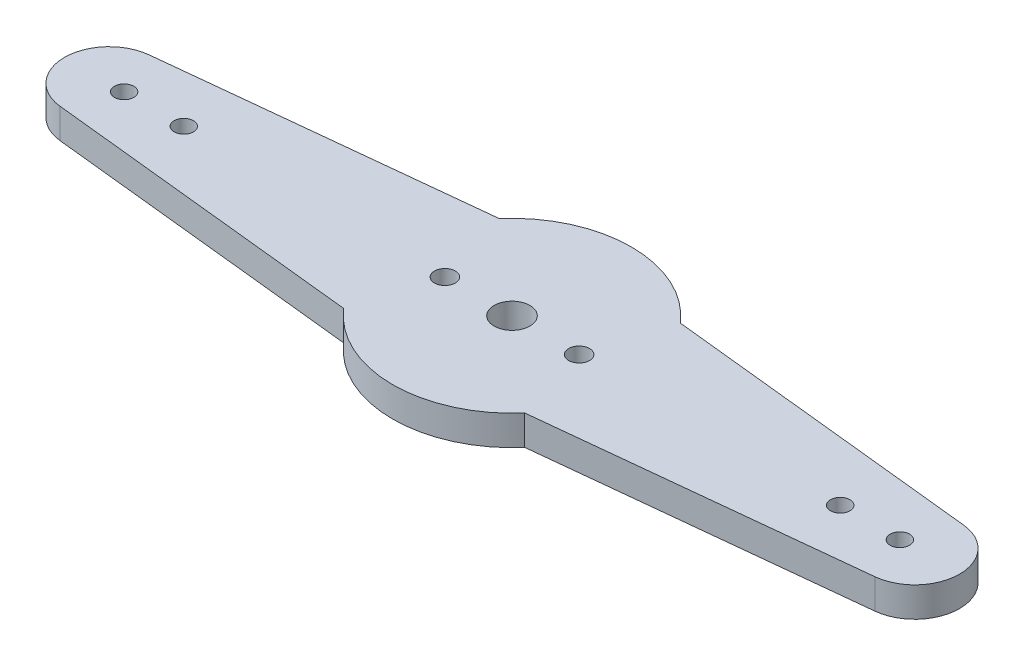
ISO-10303-21;
HEADER;
FILE_DESCRIPTION(('STEP AP214'),'2;1');
FILE_NAME('part.step','',(''),(''),'','','');
FILE_SCHEMA(('AUTOMOTIVE_DESIGN { 1 0 10303 214 1 1 1 1 }'));
ENDSEC;
DATA;
#1=APPLICATION_CONTEXT('core data for automotive mechanical design processes');
#2=APPLICATION_PROTOCOL_DEFINITION('international standard','automotive_design',2000,#1);
#3=PRODUCT_CONTEXT('',#1,'mechanical');
#4=PRODUCT('Part','Part','',(#3));
#5=PRODUCT_RELATED_PRODUCT_CATEGORY('part','',(#4));
#6=PRODUCT_DEFINITION_FORMATION('','',#4);
#7=PRODUCT_DEFINITION_CONTEXT('part definition',#1,'design');
#8=PRODUCT_DEFINITION('design','',#6,#7);
#9=PRODUCT_DEFINITION_SHAPE('','',#8);
#10=(LENGTH_UNIT() NAMED_UNIT(*) SI_UNIT(.MILLI.,.METRE.));
#11=(NAMED_UNIT(*) PLANE_ANGLE_UNIT() SI_UNIT($,.RADIAN.));
#12=(NAMED_UNIT(*) SI_UNIT($,.STERADIAN.) SOLID_ANGLE_UNIT());
#13=UNCERTAINTY_MEASURE_WITH_UNIT(LENGTH_MEASURE(1.E-05),#10,'distance_accuracy_value','');
#14=(GEOMETRIC_REPRESENTATION_CONTEXT(3) GLOBAL_UNCERTAINTY_ASSIGNED_CONTEXT((#13)) GLOBAL_UNIT_ASSIGNED_CONTEXT((#10,
#11,#12)) REPRESENTATION_CONTEXT('',''));
#15=CARTESIAN_POINT('',(0.,0.,0.));
#16=DIRECTION('',(0.,0.,1.));
#17=DIRECTION('',(1.,0.,0.));
#18=AXIS2_PLACEMENT_3D('',#15,#16,#17);
#19=CARTESIAN_POINT('',(0.,10.,0.));
#20=DIRECTION('',(0.,-1.,0.));
#21=DIRECTION('',(0.,0.,-1.));
#22=AXIS2_PLACEMENT_3D('',#19,#20,#21);
#23=CYLINDRICAL_SURFACE('',#22,40.);
#24=CARTESIAN_POINT('',(0.,0.,0.));
#25=DIRECTION('',(0.,1.,0.));
#26=DIRECTION('',(0.,0.,1.));
#27=AXIS2_PLACEMENT_3D('',#24,#25,#26);
#28=CIRCLE('',#27,40.);
#29=CARTESIAN_POINT('',(30.3249624577529,0.,-26.0844139657359));
#30=VERTEX_POINT('',#29);
#31=CARTESIAN_POINT('',(-30.3249624577529,0.,-26.0844139657359));
#32=VERTEX_POINT('',#31);
#33=EDGE_CURVE('E112',#30,#32,#28,.T.);
#34=ORIENTED_EDGE('',*,*,#33,.T.);
#35=DIRECTION('',(0.,-1.,0.));
#36=VECTOR('',#35,1.);
#37=CARTESIAN_POINT('',(-30.3249624577529,10.,-26.0844139657359));
#38=LINE('',#37,#36);
#39=CARTESIAN_POINT('',(-30.3249624577529,10.,-26.0844139657359));
#40=VERTEX_POINT('',#39);
#41=EDGE_CURVE('E11',#40,#32,#38,.T.);
#42=ORIENTED_EDGE('',*,*,#41,.F.);
#43=CARTESIAN_POINT('',(0.,10.,0.));
#44=DIRECTION('',(0.,1.,0.));
#45=DIRECTION('',(0.,0.,1.));
#46=AXIS2_PLACEMENT_3D('',#43,#44,#45);
#47=CIRCLE('',#46,40.);
#48=CARTESIAN_POINT('',(30.3249624577529,10.,-26.0844139657359));
#49=VERTEX_POINT('',#48);
#50=EDGE_CURVE('E113',#49,#40,#47,.T.);
#51=ORIENTED_EDGE('',*,*,#50,.F.);
#52=DIRECTION('',(0.,-1.,0.));
#53=VECTOR('',#52,1.);
#54=CARTESIAN_POINT('',(30.3249624577529,10.,-26.0844139657359));
#55=LINE('',#54,#53);
#56=EDGE_CURVE('E102',#49,#30,#55,.T.);
#57=ORIENTED_EDGE('',*,*,#56,.T.);
#58=EDGE_LOOP('',(#34,#42,#51,#57));
#59=FACE_BOUND('',#58,.T.);
#60=ADVANCED_FACE('F37',(#59),#23,.T.);
#61=CARTESIAN_POINT('',(-30.3249624577529,10.,-26.0844139657359));
#62=DIRECTION('',(0.104528463267647,0.,0.994521895368274));
#63=DIRECTION('',(0.994521895368274,0.,-0.104528463267647));
#64=AXIS2_PLACEMENT_3D('',#61,#62,#63);
#65=PLANE('',#64);
#66=DIRECTION('',(-0.994521895368274,0.,0.104528463267647));
#67=VECTOR('',#66,1.);
#68=CARTESIAN_POINT('',(-30.3249624577529,0.,-26.0844139657359));
#69=LINE('',#68,#67);
#70=CARTESIAN_POINT('',(-136.567926949015,0.,-14.9178284305241));
#71=VERTEX_POINT('',#70);
#72=EDGE_CURVE('E64',#32,#71,#69,.T.);
#73=ORIENTED_EDGE('',*,*,#72,.T.);
#74=DIRECTION('',(0.,-1.,0.));
#75=VECTOR('',#74,1.);
#76=CARTESIAN_POINT('',(-136.567926949015,10.,-14.9178284305241));
#77=LINE('',#76,#75);
#78=CARTESIAN_POINT('',(-136.567926949015,10.,-14.9178284305241));
#79=VERTEX_POINT('',#78);
#80=EDGE_CURVE('E45',#79,#71,#77,.T.);
#81=ORIENTED_EDGE('',*,*,#80,.F.);
#82=DIRECTION('',(-0.994521895368274,0.,0.104528463267647));
#83=VECTOR('',#82,1.);
#84=CARTESIAN_POINT('',(-30.3249624577529,10.,-26.0844139657359));
#85=LINE('',#84,#83);
#86=EDGE_CURVE('E53',#40,#79,#85,.T.);
#87=ORIENTED_EDGE('',*,*,#86,.F.);
#88=ORIENTED_EDGE('',*,*,#41,.T.);
#89=EDGE_LOOP('',(#73,#81,#87,#88));
#90=FACE_BOUND('',#89,.T.);
#91=ADVANCED_FACE('F127',(#90),#65,.F.);
#92=CARTESIAN_POINT('',(-135.,10.,0.));
#93=DIRECTION('',(0.,-1.,0.));
#94=DIRECTION('',(0.,0.,-1.));
#95=AXIS2_PLACEMENT_3D('',#92,#93,#94);
#96=CYLINDRICAL_SURFACE('',#95,15.);
#97=CARTESIAN_POINT('',(-135.,0.,0.));
#98=DIRECTION('',(0.,1.,0.));
#99=DIRECTION('',(0.,0.,1.));
#100=AXIS2_PLACEMENT_3D('',#97,#98,#99);
#101=CIRCLE('',#100,15.);
#102=CARTESIAN_POINT('',(-136.567926949015,0.,14.9178284305241));
#103=VERTEX_POINT('',#102);
#104=EDGE_CURVE('E115',#71,#103,#101,.T.);
#105=ORIENTED_EDGE('',*,*,#104,.T.);
#106=DIRECTION('',(0.,-1.,0.));
#107=VECTOR('',#106,1.);
#108=CARTESIAN_POINT('',(-136.567926949015,10.,14.9178284305241));
#109=LINE('',#108,#107);
#110=CARTESIAN_POINT('',(-136.567926949015,10.,14.9178284305241));
#111=VERTEX_POINT('',#110);
#112=EDGE_CURVE('E92',#111,#103,#109,.T.);
#113=ORIENTED_EDGE('',*,*,#112,.F.);
#114=CARTESIAN_POINT('',(-135.,10.,0.));
#115=DIRECTION('',(0.,1.,0.));
#116=DIRECTION('',(0.,0.,1.));
#117=AXIS2_PLACEMENT_3D('',#114,#115,#116);
#118=CIRCLE('',#117,15.);
#119=EDGE_CURVE('E117',#79,#111,#118,.T.);
#120=ORIENTED_EDGE('',*,*,#119,.F.);
#121=ORIENTED_EDGE('',*,*,#80,.T.);
#122=EDGE_LOOP('',(#105,#113,#120,#121));
#123=FACE_BOUND('',#122,.T.);
#124=ADVANCED_FACE('F125',(#123),#96,.T.);
#125=CARTESIAN_POINT('',(0.,10.,0.));
#126=DIRECTION('',(0.,1.,0.));
#127=DIRECTION('',(0.,0.,1.));
#128=AXIS2_PLACEMENT_3D('',#125,#126,#127);
#129=PLANE('',#128);
#130=CARTESIAN_POINT('',(130.,10.,0.));
#131=DIRECTION('',(0.,1.,0.));
#132=DIRECTION('',(0.,0.,1.));
#133=AXIS2_PLACEMENT_3D('',#130,#131,#132);
#134=CIRCLE('',#133,3.25000000000004);
#135=CARTESIAN_POINT('',(130.,10.,3.25000000000004));
#136=VERTEX_POINT('',#135);
#137=EDGE_CURVE('E390',#136,#136,#134,.T.);
#138=ORIENTED_EDGE('',*,*,#137,.F.);
#139=EDGE_LOOP('',(#138));
#140=FACE_BOUND('',#139,.T.);
#141=CARTESIAN_POINT('',(110.,10.,0.));
#142=DIRECTION('',(0.,1.,0.));
#143=DIRECTION('',(0.,0.,1.));
#144=AXIS2_PLACEMENT_3D('',#141,#142,#143);
#145=CIRCLE('',#144,3.25000000000001);
#146=CARTESIAN_POINT('',(110.,10.,3.25000000000001));
#147=VERTEX_POINT('',#146);
#148=EDGE_CURVE('E394',#147,#147,#145,.T.);
#149=ORIENTED_EDGE('',*,*,#148,.F.);
#150=EDGE_LOOP('',(#149));
#151=FACE_BOUND('',#150,.T.);
#152=CARTESIAN_POINT('',(-130.,10.,0.));
#153=DIRECTION('',(0.,1.,0.));
#154=DIRECTION('',(0.,0.,1.));
#155=AXIS2_PLACEMENT_3D('',#152,#153,#154);
#156=CIRCLE('',#155,3.25000000000001);
#157=CARTESIAN_POINT('',(-130.,10.,3.25000000000001));
#158=VERTEX_POINT('',#157);
#159=EDGE_CURVE('E425',#158,#158,#156,.T.);
#160=ORIENTED_EDGE('',*,*,#159,.F.);
#161=EDGE_LOOP('',(#160));
#162=FACE_BOUND('',#161,.T.);
#163=CARTESIAN_POINT('',(-110.,10.,0.));
#164=DIRECTION('',(0.,1.,0.));
#165=DIRECTION('',(0.,0.,1.));
#166=AXIS2_PLACEMENT_3D('',#163,#164,#165);
#167=CIRCLE('',#166,3.25000000000001);
#168=CARTESIAN_POINT('',(-110.,10.,3.25000000000001));
#169=VERTEX_POINT('',#168);
#170=EDGE_CURVE('E419',#169,#169,#167,.T.);
#171=ORIENTED_EDGE('',*,*,#170,.F.);
#172=EDGE_LOOP('',(#171));
#173=FACE_BOUND('',#172,.T.);
#174=CARTESIAN_POINT('',(0.,10.,0.));
#175=DIRECTION('',(0.,1.,0.));
#176=DIRECTION('',(0.,0.,1.));
#177=AXIS2_PLACEMENT_3D('',#174,#175,#176);
#178=CIRCLE('',#177,6.);
#179=CARTESIAN_POINT('',(0.,10.,6.));
#180=VERTEX_POINT('',#179);
#181=EDGE_CURVE('E411',#180,#180,#178,.T.);
#182=ORIENTED_EDGE('',*,*,#181,.F.);
#183=EDGE_LOOP('',(#182));
#184=FACE_BOUND('',#183,.T.);
#185=CARTESIAN_POINT('',(22.5,10.,0.));
#186=DIRECTION('',(0.,1.,0.));
#187=DIRECTION('',(0.,0.,1.));
#188=AXIS2_PLACEMENT_3D('',#185,#186,#187);
#189=CIRCLE('',#188,3.5);
#190=CARTESIAN_POINT('',(22.5,10.,3.49999999999999));
#191=VERTEX_POINT('',#190);
#192=EDGE_CURVE('E402',#191,#191,#189,.T.);
#193=ORIENTED_EDGE('',*,*,#192,.F.);
#194=EDGE_LOOP('',(#193));
#195=FACE_BOUND('',#194,.T.);
#196=CARTESIAN_POINT('',(-22.5,10.,0.));
#197=DIRECTION('',(0.,1.,0.));
#198=DIRECTION('',(0.,0.,1.));
#199=AXIS2_PLACEMENT_3D('',#196,#197,#198);
#200=CIRCLE('',#199,3.5);
#201=CARTESIAN_POINT('',(-22.5,10.,3.5));
#202=VERTEX_POINT('',#201);
#203=EDGE_CURVE('E176',#202,#202,#200,.T.);
#204=ORIENTED_EDGE('',*,*,#203,.F.);
#205=EDGE_LOOP('',(#204));
#206=FACE_BOUND('',#205,.T.);
#207=ORIENTED_EDGE('',*,*,#50,.T.);
#208=ORIENTED_EDGE('',*,*,#86,.T.);
#209=ORIENTED_EDGE('',*,*,#119,.T.);
#210=DIRECTION('',(-0.994521895368274,0.,-0.104528463267647));
#211=VECTOR('',#210,1.);
#212=CARTESIAN_POINT('',(-30.3249624577529,10.,26.0844139657359));
#213=LINE('',#212,#211);
#214=CARTESIAN_POINT('',(-30.3249624577529,10.,26.0844139657359));
#215=VERTEX_POINT('',#214);
#216=EDGE_CURVE('E93',#215,#111,#213,.T.);
#217=ORIENTED_EDGE('',*,*,#216,.F.);
#218=CARTESIAN_POINT('',(0.,10.,0.));
#219=DIRECTION('',(0.,-1.,0.));
#220=DIRECTION('',(0.,0.,-1.));
#221=AXIS2_PLACEMENT_3D('',#218,#219,#220);
#222=CIRCLE('',#221,40.);
#223=CARTESIAN_POINT('',(30.3249624577529,10.,26.0844139657359));
#224=VERTEX_POINT('',#223);
#225=EDGE_CURVE('E90',#224,#215,#222,.T.);
#226=ORIENTED_EDGE('',*,*,#225,.F.);
#227=DIRECTION('',(0.994521895368274,0.,-0.104528463267647));
#228=VECTOR('',#227,1.);
#229=CARTESIAN_POINT('',(30.3249624577529,10.,26.0844139657359));
#230=LINE('',#229,#228);
#231=CARTESIAN_POINT('',(136.567926949015,10.,14.9178284305241));
#232=VERTEX_POINT('',#231);
#233=EDGE_CURVE('E165',#224,#232,#230,.T.);
#234=ORIENTED_EDGE('',*,*,#233,.T.);
#235=CARTESIAN_POINT('',(135.,10.,0.));
#236=DIRECTION('',(0.,-1.,0.));
#237=DIRECTION('',(0.,0.,1.));
#238=AXIS2_PLACEMENT_3D('',#235,#236,#237);
#239=CIRCLE('',#238,15.);
#240=CARTESIAN_POINT('',(136.567926949015,10.,-14.9178284305241));
#241=VERTEX_POINT('',#240);
#242=EDGE_CURVE('E156',#241,#232,#239,.T.);
#243=ORIENTED_EDGE('',*,*,#242,.F.);
#244=DIRECTION('',(0.994521895368274,0.,0.104528463267647));
#245=VECTOR('',#244,1.);
#246=CARTESIAN_POINT('',(30.3249624577529,10.,-26.0844139657359));
#247=LINE('',#246,#245);
#248=EDGE_CURVE('E150',#49,#241,#247,.T.);
#249=ORIENTED_EDGE('',*,*,#248,.F.);
#250=EDGE_LOOP('',(#207,#208,#209,#217,#226,#234,#243,#249));
#251=FACE_BOUND('',#250,.T.);
#252=ADVANCED_FACE('F160',(#140,#151,#162,#173,#184,#195,#206,#251),#129,.T.);
#253=CARTESIAN_POINT('',(0.,0.,0.));
#254=DIRECTION('',(0.,1.,0.));
#255=DIRECTION('',(0.,0.,1.));
#256=AXIS2_PLACEMENT_3D('',#253,#254,#255);
#257=PLANE('',#256);
#258=CARTESIAN_POINT('',(130.,0.,0.));
#259=DIRECTION('',(0.,1.,0.));
#260=DIRECTION('',(0.,0.,1.));
#261=AXIS2_PLACEMENT_3D('',#258,#259,#260);
#262=CIRCLE('',#261,3.25000000000004);
#263=CARTESIAN_POINT('',(130.,0.,3.25000000000004));
#264=VERTEX_POINT('',#263);
#265=EDGE_CURVE('E387',#264,#264,#262,.T.);
#266=ORIENTED_EDGE('',*,*,#265,.T.);
#267=EDGE_LOOP('',(#266));
#268=FACE_BOUND('',#267,.T.);
#269=CARTESIAN_POINT('',(110.,0.,0.));
#270=DIRECTION('',(0.,1.,0.));
#271=DIRECTION('',(0.,0.,1.));
#272=AXIS2_PLACEMENT_3D('',#269,#270,#271);
#273=CIRCLE('',#272,3.25000000000001);
#274=CARTESIAN_POINT('',(110.,0.,3.25000000000001));
#275=VERTEX_POINT('',#274);
#276=EDGE_CURVE('E391',#275,#275,#273,.T.);
#277=ORIENTED_EDGE('',*,*,#276,.T.);
#278=EDGE_LOOP('',(#277));
#279=FACE_BOUND('',#278,.T.);
#280=CARTESIAN_POINT('',(-130.,0.,0.));
#281=DIRECTION('',(0.,1.,0.));
#282=DIRECTION('',(0.,0.,1.));
#283=AXIS2_PLACEMENT_3D('',#280,#281,#282);
#284=CIRCLE('',#283,3.25000000000001);
#285=CARTESIAN_POINT('',(-130.,0.,3.25000000000001));
#286=VERTEX_POINT('',#285);
#287=EDGE_CURVE('E428',#286,#286,#284,.T.);
#288=ORIENTED_EDGE('',*,*,#287,.T.);
#289=EDGE_LOOP('',(#288));
#290=FACE_BOUND('',#289,.T.);
#291=CARTESIAN_POINT('',(-110.,0.,0.));
#292=DIRECTION('',(0.,1.,0.));
#293=DIRECTION('',(0.,0.,1.));
#294=AXIS2_PLACEMENT_3D('',#291,#292,#293);
#295=CIRCLE('',#294,3.25000000000001);
#296=CARTESIAN_POINT('',(-110.,0.,3.25000000000001));
#297=VERTEX_POINT('',#296);
#298=EDGE_CURVE('E422',#297,#297,#295,.T.);
#299=ORIENTED_EDGE('',*,*,#298,.T.);
#300=EDGE_LOOP('',(#299));
#301=FACE_BOUND('',#300,.T.);
#302=CARTESIAN_POINT('',(0.,0.,0.));
#303=DIRECTION('',(0.,1.,0.));
#304=DIRECTION('',(0.,0.,1.));
#305=AXIS2_PLACEMENT_3D('',#302,#303,#304);
#306=CIRCLE('',#305,6.);
#307=CARTESIAN_POINT('',(0.,0.,6.));
#308=VERTEX_POINT('',#307);
#309=EDGE_CURVE('E416',#308,#308,#306,.T.);
#310=ORIENTED_EDGE('',*,*,#309,.T.);
#311=EDGE_LOOP('',(#310));
#312=FACE_BOUND('',#311,.T.);
#313=CARTESIAN_POINT('',(22.5,0.,0.));
#314=DIRECTION('',(0.,1.,0.));
#315=DIRECTION('',(0.,0.,1.));
#316=AXIS2_PLACEMENT_3D('',#313,#314,#315);
#317=CIRCLE('',#316,3.5);
#318=CARTESIAN_POINT('',(22.5,0.,3.49999999999999));
#319=VERTEX_POINT('',#318);
#320=EDGE_CURVE('E406',#319,#319,#317,.T.);
#321=ORIENTED_EDGE('',*,*,#320,.T.);
#322=EDGE_LOOP('',(#321));
#323=FACE_BOUND('',#322,.T.);
#324=CARTESIAN_POINT('',(-22.5,0.,0.));
#325=DIRECTION('',(0.,1.,0.));
#326=DIRECTION('',(0.,0.,1.));
#327=AXIS2_PLACEMENT_3D('',#324,#325,#326);
#328=CIRCLE('',#327,3.5);
#329=CARTESIAN_POINT('',(-22.5,0.,3.5));
#330=VERTEX_POINT('',#329);
#331=EDGE_CURVE('E173',#330,#330,#328,.T.);
#332=ORIENTED_EDGE('',*,*,#331,.T.);
#333=EDGE_LOOP('',(#332));
#334=FACE_BOUND('',#333,.T.);
#335=ORIENTED_EDGE('',*,*,#33,.F.);
#336=DIRECTION('',(0.994521895368274,0.,0.104528463267647));
#337=VECTOR('',#336,1.);
#338=CARTESIAN_POINT('',(30.3249624577529,0.,-26.0844139657359));
#339=LINE('',#338,#337);
#340=CARTESIAN_POINT('',(136.567926949015,0.,-14.9178284305241));
#341=VERTEX_POINT('',#340);
#342=EDGE_CURVE('E137',#30,#341,#339,.T.);
#343=ORIENTED_EDGE('',*,*,#342,.T.);
#344=CARTESIAN_POINT('',(135.,0.,0.));
#345=DIRECTION('',(0.,-1.,0.));
#346=DIRECTION('',(0.,0.,1.));
#347=AXIS2_PLACEMENT_3D('',#344,#345,#346);
#348=CIRCLE('',#347,15.);
#349=CARTESIAN_POINT('',(136.567926949015,0.,14.9178284305241));
#350=VERTEX_POINT('',#349);
#351=EDGE_CURVE('E147',#341,#350,#348,.T.);
#352=ORIENTED_EDGE('',*,*,#351,.T.);
#353=DIRECTION('',(0.994521895368274,0.,-0.104528463267647));
#354=VECTOR('',#353,1.);
#355=CARTESIAN_POINT('',(30.3249624577529,0.,26.0844139657359));
#356=LINE('',#355,#354);
#357=CARTESIAN_POINT('',(30.3249624577529,0.,26.0844139657359));
#358=VERTEX_POINT('',#357);
#359=EDGE_CURVE('E101',#358,#350,#356,.T.);
#360=ORIENTED_EDGE('',*,*,#359,.F.);
#361=CARTESIAN_POINT('',(0.,0.,0.));
#362=DIRECTION('',(0.,-1.,0.));
#363=DIRECTION('',(0.,0.,-1.));
#364=AXIS2_PLACEMENT_3D('',#361,#362,#363);
#365=CIRCLE('',#364,40.);
#366=CARTESIAN_POINT('',(-30.3249624577529,0.,26.0844139657359));
#367=VERTEX_POINT('',#366);
#368=EDGE_CURVE('E87',#358,#367,#365,.T.);
#369=ORIENTED_EDGE('',*,*,#368,.T.);
#370=DIRECTION('',(-0.994521895368274,0.,-0.104528463267647));
#371=VECTOR('',#370,1.);
#372=CARTESIAN_POINT('',(-30.3249624577529,0.,26.0844139657359));
#373=LINE('',#372,#371);
#374=EDGE_CURVE('E98',#367,#103,#373,.T.);
#375=ORIENTED_EDGE('',*,*,#374,.T.);
#376=ORIENTED_EDGE('',*,*,#104,.F.);
#377=ORIENTED_EDGE('',*,*,#72,.F.);
#378=EDGE_LOOP('',(#335,#343,#352,#360,#369,#375,#376,#377));
#379=FACE_BOUND('',#378,.T.);
#380=ADVANCED_FACE('F97',(#268,#279,#290,#301,#312,#323,#334,#379),#257,.F.);
#381=CARTESIAN_POINT('',(0.,10.,0.));
#382=DIRECTION('',(0.,-1.,0.));
#383=DIRECTION('',(0.,0.,-1.));
#384=AXIS2_PLACEMENT_3D('',#381,#382,#383);
#385=CYLINDRICAL_SURFACE('',#384,40.);
#386=ORIENTED_EDGE('',*,*,#368,.F.);
#387=DIRECTION('',(0.,-1.,0.));
#388=VECTOR('',#387,1.);
#389=CARTESIAN_POINT('',(30.3249624577529,10.,26.0844139657359));
#390=LINE('',#389,#388);
#391=EDGE_CURVE('E153',#224,#358,#390,.T.);
#392=ORIENTED_EDGE('',*,*,#391,.F.);
#393=ORIENTED_EDGE('',*,*,#225,.T.);
#394=DIRECTION('',(0.,-1.,0.));
#395=VECTOR('',#394,1.);
#396=CARTESIAN_POINT('',(-30.3249624577529,10.,26.0844139657359));
#397=LINE('',#396,#395);
#398=EDGE_CURVE('E72',#215,#367,#397,.T.);
#399=ORIENTED_EDGE('',*,*,#398,.T.);
#400=EDGE_LOOP('',(#386,#392,#393,#399));
#401=FACE_BOUND('',#400,.T.);
#402=ADVANCED_FACE('F84',(#401),#385,.T.);
#403=CARTESIAN_POINT('',(-30.3249624577529,10.,26.0844139657359));
#404=DIRECTION('',(-0.104528463267647,0.,0.994521895368274));
#405=DIRECTION('',(0.994521895368274,0.,0.104528463267647));
#406=AXIS2_PLACEMENT_3D('',#403,#404,#405);
#407=PLANE('',#406);
#408=ORIENTED_EDGE('',*,*,#374,.F.);
#409=ORIENTED_EDGE('',*,*,#398,.F.);
#410=ORIENTED_EDGE('',*,*,#216,.T.);
#411=ORIENTED_EDGE('',*,*,#112,.T.);
#412=EDGE_LOOP('',(#408,#409,#410,#411));
#413=FACE_BOUND('',#412,.T.);
#414=ADVANCED_FACE('F105',(#413),#407,.T.);
#415=CARTESIAN_POINT('',(30.3249624577529,10.,-26.0844139657359));
#416=DIRECTION('',(-0.104528463267647,0.,0.994521895368274));
#417=DIRECTION('',(-0.994521895368274,0.,-0.104528463267647));
#418=AXIS2_PLACEMENT_3D('',#415,#416,#417);
#419=PLANE('',#418);
#420=ORIENTED_EDGE('',*,*,#342,.F.);
#421=ORIENTED_EDGE('',*,*,#56,.F.);
#422=ORIENTED_EDGE('',*,*,#248,.T.);
#423=DIRECTION('',(0.,-1.,0.));
#424=VECTOR('',#423,1.);
#425=CARTESIAN_POINT('',(136.567926949015,10.,-14.9178284305241));
#426=LINE('',#425,#424);
#427=EDGE_CURVE('E146',#241,#341,#426,.T.);
#428=ORIENTED_EDGE('',*,*,#427,.T.);
#429=EDGE_LOOP('',(#420,#421,#422,#428));
#430=FACE_BOUND('',#429,.T.);
#431=ADVANCED_FACE('F142',(#430),#419,.F.);
#432=CARTESIAN_POINT('',(135.,10.,0.));
#433=DIRECTION('',(0.,-1.,0.));
#434=DIRECTION('',(0.,0.,-1.));
#435=AXIS2_PLACEMENT_3D('',#432,#433,#434);
#436=CYLINDRICAL_SURFACE('',#435,15.);
#437=ORIENTED_EDGE('',*,*,#351,.F.);
#438=ORIENTED_EDGE('',*,*,#427,.F.);
#439=ORIENTED_EDGE('',*,*,#242,.T.);
#440=DIRECTION('',(0.,-1.,0.));
#441=VECTOR('',#440,1.);
#442=CARTESIAN_POINT('',(136.567926949015,10.,14.9178284305241));
#443=LINE('',#442,#441);
#444=EDGE_CURVE('E148',#232,#350,#443,.T.);
#445=ORIENTED_EDGE('',*,*,#444,.T.);
#446=EDGE_LOOP('',(#437,#438,#439,#445));
#447=FACE_BOUND('',#446,.T.);
#448=ADVANCED_FACE('F181',(#447),#436,.T.);
#449=CARTESIAN_POINT('',(30.3249624577529,10.,26.0844139657359));
#450=DIRECTION('',(0.104528463267647,0.,0.994521895368274));
#451=DIRECTION('',(-0.994521895368274,0.,0.104528463267647));
#452=AXIS2_PLACEMENT_3D('',#449,#450,#451);
#453=PLANE('',#452);
#454=ORIENTED_EDGE('',*,*,#359,.T.);
#455=ORIENTED_EDGE('',*,*,#444,.F.);
#456=ORIENTED_EDGE('',*,*,#233,.F.);
#457=ORIENTED_EDGE('',*,*,#391,.T.);
#458=EDGE_LOOP('',(#454,#455,#456,#457));
#459=FACE_BOUND('',#458,.T.);
#460=ADVANCED_FACE('F170',(#459),#453,.T.);
#461=CARTESIAN_POINT('',(-22.5,0.,0.));
#462=DIRECTION('',(0.,1.,0.));
#463=DIRECTION('',(0.,0.,1.));
#464=AXIS2_PLACEMENT_3D('',#461,#462,#463);
#465=CYLINDRICAL_SURFACE('',#464,3.5);
#466=ORIENTED_EDGE('',*,*,#331,.F.);
#467=EDGE_LOOP('',(#466));
#468=FACE_BOUND('',#467,.T.);
#469=ORIENTED_EDGE('',*,*,#203,.T.);
#470=EDGE_LOOP('',(#469));
#471=FACE_BOUND('',#470,.T.);
#472=ADVANCED_FACE('F194',(#468,#471),#465,.F.);
#473=CARTESIAN_POINT('',(22.5,0.,0.));
#474=DIRECTION('',(0.,1.,0.));
#475=DIRECTION('',(0.,0.,1.));
#476=AXIS2_PLACEMENT_3D('',#473,#474,#475);
#477=CYLINDRICAL_SURFACE('',#476,3.5);
#478=ORIENTED_EDGE('',*,*,#320,.F.);
#479=EDGE_LOOP('',(#478));
#480=FACE_BOUND('',#479,.T.);
#481=ORIENTED_EDGE('',*,*,#192,.T.);
#482=EDGE_LOOP('',(#481));
#483=FACE_BOUND('',#482,.T.);
#484=ADVANCED_FACE('F263',(#480,#483),#477,.F.);
#485=CARTESIAN_POINT('',(0.,0.,0.));
#486=DIRECTION('',(0.,1.,0.));
#487=DIRECTION('',(0.,0.,1.));
#488=AXIS2_PLACEMENT_3D('',#485,#486,#487);
#489=CYLINDRICAL_SURFACE('',#488,6.);
#490=ORIENTED_EDGE('',*,*,#309,.F.);
#491=EDGE_LOOP('',(#490));
#492=FACE_BOUND('',#491,.T.);
#493=ORIENTED_EDGE('',*,*,#181,.T.);
#494=EDGE_LOOP('',(#493));
#495=FACE_BOUND('',#494,.T.);
#496=ADVANCED_FACE('F274',(#492,#495),#489,.F.);
#497=CARTESIAN_POINT('',(-110.,0.,0.));
#498=DIRECTION('',(0.,1.,0.));
#499=DIRECTION('',(0.,0.,1.));
#500=AXIS2_PLACEMENT_3D('',#497,#498,#499);
#501=CYLINDRICAL_SURFACE('',#500,3.25000000000001);
#502=ORIENTED_EDGE('',*,*,#298,.F.);
#503=EDGE_LOOP('',(#502));
#504=FACE_BOUND('',#503,.T.);
#505=ORIENTED_EDGE('',*,*,#170,.T.);
#506=EDGE_LOOP('',(#505));
#507=FACE_BOUND('',#506,.T.);
#508=ADVANCED_FACE('F285',(#504,#507),#501,.F.);
#509=CARTESIAN_POINT('',(-130.,0.,0.));
#510=DIRECTION('',(0.,1.,0.));
#511=DIRECTION('',(0.,0.,1.));
#512=AXIS2_PLACEMENT_3D('',#509,#510,#511);
#513=CYLINDRICAL_SURFACE('',#512,3.25000000000001);
#514=ORIENTED_EDGE('',*,*,#287,.F.);
#515=EDGE_LOOP('',(#514));
#516=FACE_BOUND('',#515,.T.);
#517=ORIENTED_EDGE('',*,*,#159,.T.);
#518=EDGE_LOOP('',(#517));
#519=FACE_BOUND('',#518,.T.);
#520=ADVANCED_FACE('F296',(#516,#519),#513,.F.);
#521=CARTESIAN_POINT('',(110.,0.,0.));
#522=DIRECTION('',(0.,1.,0.));
#523=DIRECTION('',(0.,0.,1.));
#524=AXIS2_PLACEMENT_3D('',#521,#522,#523);
#525=CYLINDRICAL_SURFACE('',#524,3.25000000000001);
#526=ORIENTED_EDGE('',*,*,#276,.F.);
#527=EDGE_LOOP('',(#526));
#528=FACE_BOUND('',#527,.T.);
#529=ORIENTED_EDGE('',*,*,#148,.T.);
#530=EDGE_LOOP('',(#529));
#531=FACE_BOUND('',#530,.T.);
#532=ADVANCED_FACE('F307',(#528,#531),#525,.F.);
#533=CARTESIAN_POINT('',(130.,0.,0.));
#534=DIRECTION('',(0.,1.,0.));
#535=DIRECTION('',(0.,0.,1.));
#536=AXIS2_PLACEMENT_3D('',#533,#534,#535);
#537=CYLINDRICAL_SURFACE('',#536,3.25000000000004);
#538=ORIENTED_EDGE('',*,*,#265,.F.);
#539=EDGE_LOOP('',(#538));
#540=FACE_BOUND('',#539,.T.);
#541=ORIENTED_EDGE('',*,*,#137,.T.);
#542=EDGE_LOOP('',(#541));
#543=FACE_BOUND('',#542,.T.);
#544=ADVANCED_FACE('F318',(#540,#543),#537,.F.);
#545=CLOSED_SHELL('',(#60,#91,#124,#252,#380,#402,#414,#431,#448,#460,#472,#484,#496,#508,#520,
#532,#544));
#546=MANIFOLD_SOLID_BREP('B2',#545);
#547=ADVANCED_BREP_SHAPE_REPRESENTATION('',(#18,#546),#14);
#548=SHAPE_DEFINITION_REPRESENTATION(#9,#547);
ENDSEC;
END-ISO-10303-21;
